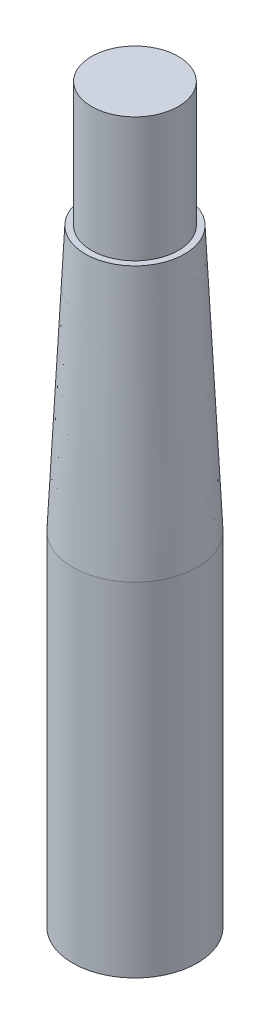
ISO-10303-21;
HEADER;
FILE_DESCRIPTION(('STEP AP214'),'2;1');
FILE_NAME('part.step','',(''),(''),'','','');
FILE_SCHEMA(('AUTOMOTIVE_DESIGN { 1 0 10303 214 1 1 1 1 }'));
ENDSEC;
DATA;
#1=APPLICATION_CONTEXT('core data for automotive mechanical design processes');
#2=APPLICATION_PROTOCOL_DEFINITION('international standard','automotive_design',2000,#1);
#3=PRODUCT_CONTEXT('',#1,'mechanical');
#4=PRODUCT('Part','Part','',(#3));
#5=PRODUCT_RELATED_PRODUCT_CATEGORY('part','',(#4));
#6=PRODUCT_DEFINITION_FORMATION('','',#4);
#7=PRODUCT_DEFINITION_CONTEXT('part definition',#1,'design');
#8=PRODUCT_DEFINITION('design','',#6,#7);
#9=PRODUCT_DEFINITION_SHAPE('','',#8);
#10=(LENGTH_UNIT() NAMED_UNIT(*) SI_UNIT(.MILLI.,.METRE.));
#11=(NAMED_UNIT(*) PLANE_ANGLE_UNIT() SI_UNIT($,.RADIAN.));
#12=(NAMED_UNIT(*) SI_UNIT($,.STERADIAN.) SOLID_ANGLE_UNIT());
#13=UNCERTAINTY_MEASURE_WITH_UNIT(LENGTH_MEASURE(1.E-05),#10,'distance_accuracy_value','');
#14=(GEOMETRIC_REPRESENTATION_CONTEXT(3) GLOBAL_UNCERTAINTY_ASSIGNED_CONTEXT((#13)) GLOBAL_UNIT_ASSIGNED_CONTEXT((#10,
#11,#12)) REPRESENTATION_CONTEXT('',''));
#15=CARTESIAN_POINT('',(0.,0.,0.));
#16=DIRECTION('',(0.,0.,1.));
#17=DIRECTION('',(1.,0.,0.));
#18=AXIS2_PLACEMENT_3D('',#15,#16,#17);
#19=CARTESIAN_POINT('',(0.,22.,0.));
#20=DIRECTION('',(0.,-1.,0.));
#21=DIRECTION('',(0.,0.,-1.));
#22=AXIS2_PLACEMENT_3D('',#19,#20,#21);
#23=CYLINDRICAL_SURFACE('',#22,4.);
#24=CARTESIAN_POINT('',(0.,22.,0.));
#25=DIRECTION('',(0.,1.,0.));
#26=DIRECTION('',(0.,0.,1.));
#27=AXIS2_PLACEMENT_3D('',#24,#25,#26);
#28=CIRCLE('',#27,4.);
#29=CARTESIAN_POINT('',(0.,22.,4.));
#30=VERTEX_POINT('',#29);
#31=EDGE_CURVE('E49',#30,#30,#28,.T.);
#32=ORIENTED_EDGE('',*,*,#31,.F.);
#33=EDGE_LOOP('',(#32));
#34=FACE_BOUND('',#33,.T.);
#35=CARTESIAN_POINT('',(0.,0.,0.));
#36=DIRECTION('',(0.,1.,0.));
#37=DIRECTION('',(0.,0.,1.));
#38=AXIS2_PLACEMENT_3D('',#35,#36,#37);
#39=CIRCLE('',#38,4.);
#40=CARTESIAN_POINT('',(0.,0.,4.));
#41=VERTEX_POINT('',#40);
#42=EDGE_CURVE('E44',#41,#41,#39,.T.);
#43=ORIENTED_EDGE('',*,*,#42,.T.);
#44=EDGE_LOOP('',(#43));
#45=FACE_BOUND('',#44,.T.);
#46=ADVANCED_FACE('F41',(#34,#45),#23,.T.);
#47=CARTESIAN_POINT('',(0.,0.,0.));
#48=DIRECTION('',(0.,1.,0.));
#49=DIRECTION('',(0.,0.,1.));
#50=AXIS2_PLACEMENT_3D('',#47,#48,#49);
#51=PLANE('',#50);
#52=ORIENTED_EDGE('',*,*,#42,.F.);
#53=EDGE_LOOP('',(#52));
#54=FACE_BOUND('',#53,.T.);
#55=ADVANCED_FACE('F84',(#54),#51,.F.);
#56=CARTESIAN_POINT('',(0.,22.,0.));
#57=DIRECTION('',(0.,-1.,0.));
#58=DIRECTION('',(0.,0.,1.));
#59=AXIS2_PLACEMENT_3D('',#56,#57,#58);
#60=CONICAL_SURFACE('',#59,4.,0.0479965544298442);
#61=CARTESIAN_POINT('',(0.,39.,0.));
#62=DIRECTION('',(0.,1.,0.));
#63=DIRECTION('',(0.,0.,1.));
#64=AXIS2_PLACEMENT_3D('',#61,#62,#63);
#65=CIRCLE('',#64,3.18343144375181);
#66=CARTESIAN_POINT('',(0.,39.,3.18343144375181));
#67=VERTEX_POINT('',#66);
#68=EDGE_CURVE('E58',#67,#67,#65,.T.);
#69=ORIENTED_EDGE('',*,*,#68,.F.);
#70=EDGE_LOOP('',(#69));
#71=FACE_BOUND('',#70,.T.);
#72=ORIENTED_EDGE('',*,*,#31,.T.);
#73=EDGE_LOOP('',(#72));
#74=FACE_BOUND('',#73,.T.);
#75=ADVANCED_FACE('F80',(#71,#74),#60,.T.);
#76=CARTESIAN_POINT('',(0.,39.,0.));
#77=DIRECTION('',(0.,1.,0.));
#78=DIRECTION('',(0.,0.,1.));
#79=AXIS2_PLACEMENT_3D('',#76,#77,#78);
#80=PLANE('',#79);
#81=CARTESIAN_POINT('',(0.,39.,0.));
#82=DIRECTION('',(0.,1.,0.));
#83=DIRECTION('',(0.,0.,1.));
#84=AXIS2_PLACEMENT_3D('',#81,#82,#83);
#85=CIRCLE('',#84,2.78655644375181);
#86=CARTESIAN_POINT('',(0.,39.,2.78655644375181));
#87=VERTEX_POINT('',#86);
#88=EDGE_CURVE('E10',#87,#87,#85,.T.);
#89=ORIENTED_EDGE('',*,*,#88,.F.);
#90=EDGE_LOOP('',(#89));
#91=FACE_BOUND('',#90,.T.);
#92=ORIENTED_EDGE('',*,*,#68,.T.);
#93=EDGE_LOOP('',(#92));
#94=FACE_BOUND('',#93,.T.);
#95=ADVANCED_FACE('F73',(#91,#94),#80,.T.);
#96=CARTESIAN_POINT('',(0.,47.,0.));
#97=DIRECTION('',(0.,-1.,0.));
#98=DIRECTION('',(0.,0.,-1.));
#99=AXIS2_PLACEMENT_3D('',#96,#97,#98);
#100=CYLINDRICAL_SURFACE('',#99,2.78655644375181);
#101=CARTESIAN_POINT('',(0.,47.,0.));
#102=DIRECTION('',(0.,1.,0.));
#103=DIRECTION('',(0.,0.,1.));
#104=AXIS2_PLACEMENT_3D('',#101,#102,#103);
#105=CIRCLE('',#104,2.78655644375181);
#106=CARTESIAN_POINT('',(0.,47.,2.78655644375181));
#107=VERTEX_POINT('',#106);
#108=EDGE_CURVE('E57',#107,#107,#105,.T.);
#109=ORIENTED_EDGE('',*,*,#108,.F.);
#110=EDGE_LOOP('',(#109));
#111=FACE_BOUND('',#110,.T.);
#112=ORIENTED_EDGE('',*,*,#88,.T.);
#113=EDGE_LOOP('',(#112));
#114=FACE_BOUND('',#113,.T.);
#115=ADVANCED_FACE('F71',(#111,#114),#100,.T.);
#116=CARTESIAN_POINT('',(0.,47.,0.));
#117=DIRECTION('',(0.,1.,0.));
#118=DIRECTION('',(0.,0.,1.));
#119=AXIS2_PLACEMENT_3D('',#116,#117,#118);
#120=PLANE('',#119);
#121=ORIENTED_EDGE('',*,*,#108,.T.);
#122=EDGE_LOOP('',(#121));
#123=FACE_BOUND('',#122,.T.);
#124=ADVANCED_FACE('F69',(#123),#120,.T.);
#125=CLOSED_SHELL('',(#46,#55,#75,#95,#115,#124));
#126=MANIFOLD_SOLID_BREP('B2',#125);
#127=ADVANCED_BREP_SHAPE_REPRESENTATION('',(#18,#126),#14);
#128=SHAPE_DEFINITION_REPRESENTATION(#9,#127);
ENDSEC;
END-ISO-10303-21;
